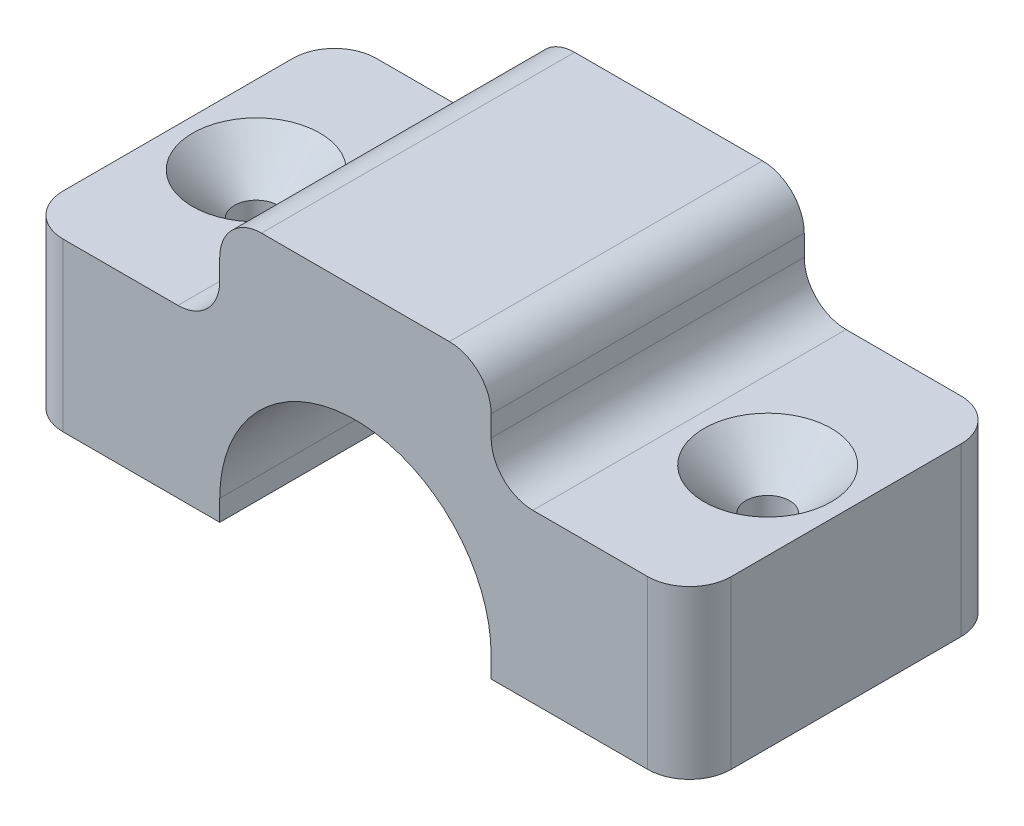
ISO-10303-21;
HEADER;
FILE_DESCRIPTION(('STEP AP214'),'2;1');
FILE_NAME('part.step','',(''),(''),'','','');
FILE_SCHEMA(('AUTOMOTIVE_DESIGN { 1 0 10303 214 1 1 1 1 }'));
ENDSEC;
DATA;
#1=APPLICATION_CONTEXT('core data for automotive mechanical design processes');
#2=APPLICATION_PROTOCOL_DEFINITION('international standard','automotive_design',2000,#1);
#3=PRODUCT_CONTEXT('',#1,'mechanical');
#4=PRODUCT('Part','Part','',(#3));
#5=PRODUCT_RELATED_PRODUCT_CATEGORY('part','',(#4));
#6=PRODUCT_DEFINITION_FORMATION('','',#4);
#7=PRODUCT_DEFINITION_CONTEXT('part definition',#1,'design');
#8=PRODUCT_DEFINITION('design','',#6,#7);
#9=PRODUCT_DEFINITION_SHAPE('','',#8);
#10=(LENGTH_UNIT() NAMED_UNIT(*) SI_UNIT(.MILLI.,.METRE.));
#11=(NAMED_UNIT(*) PLANE_ANGLE_UNIT() SI_UNIT($,.RADIAN.));
#12=(NAMED_UNIT(*) SI_UNIT($,.STERADIAN.) SOLID_ANGLE_UNIT());
#13=UNCERTAINTY_MEASURE_WITH_UNIT(LENGTH_MEASURE(1.E-05),#10,'distance_accuracy_value','');
#14=(GEOMETRIC_REPRESENTATION_CONTEXT(3) GLOBAL_UNCERTAINTY_ASSIGNED_CONTEXT((#13)) GLOBAL_UNIT_ASSIGNED_CONTEXT((#10,
#11,#12)) REPRESENTATION_CONTEXT('',''));
#15=CARTESIAN_POINT('',(0.,0.,0.));
#16=DIRECTION('',(0.,0.,1.));
#17=DIRECTION('',(1.,0.,0.));
#18=AXIS2_PLACEMENT_3D('',#15,#16,#17);
#19=CARTESIAN_POINT('',(0.,12.,15.));
#20=DIRECTION('',(0.,-1.,0.));
#21=DIRECTION('',(1.,0.,0.));
#22=AXIS2_PLACEMENT_3D('',#19,#20,#21);
#23=PLANE('',#22);
#24=DIRECTION('',(-1.,0.,0.));
#25=VECTOR('',#24,1.);
#26=CARTESIAN_POINT('',(0.,12.,15.));
#27=LINE('',#26,#25);
#28=CARTESIAN_POINT('',(4.5,12.,15.));
#29=VERTEX_POINT('',#28);
#30=CARTESIAN_POINT('',(-4.5,12.,15.));
#31=VERTEX_POINT('',#30);
#32=EDGE_CURVE('E418',#29,#31,#27,.T.);
#33=ORIENTED_EDGE('',*,*,#32,.F.);
#34=DIRECTION('',(0.,0.,-1.));
#35=VECTOR('',#34,1.);
#36=CARTESIAN_POINT('',(4.5,12.,0.));
#37=LINE('',#36,#35);
#38=CARTESIAN_POINT('',(4.5,12.,0.));
#39=VERTEX_POINT('',#38);
#40=EDGE_CURVE('E240',#29,#39,#37,.T.);
#41=ORIENTED_EDGE('',*,*,#40,.T.);
#42=DIRECTION('',(-1.,0.,0.));
#43=VECTOR('',#42,1.);
#44=CARTESIAN_POINT('',(0.,12.,0.));
#45=LINE('',#44,#43);
#46=CARTESIAN_POINT('',(-4.5,12.,0.));
#47=VERTEX_POINT('',#46);
#48=EDGE_CURVE('E419',#39,#47,#45,.T.);
#49=ORIENTED_EDGE('',*,*,#48,.T.);
#50=DIRECTION('',(0.,0.,1.));
#51=VECTOR('',#50,1.);
#52=CARTESIAN_POINT('',(-4.5,12.,15.));
#53=LINE('',#52,#51);
#54=EDGE_CURVE('E237',#47,#31,#53,.T.);
#55=ORIENTED_EDGE('',*,*,#54,.T.);
#56=EDGE_LOOP('',(#33,#41,#49,#55));
#57=FACE_BOUND('',#56,.T.);
#58=ADVANCED_FACE('F39',(#57),#23,.F.);
#59=CARTESIAN_POINT('',(0.,0.,15.));
#60=DIRECTION('',(0.,0.,-1.));
#61=DIRECTION('',(-1.,0.,0.));
#62=AXIS2_PLACEMENT_3D('',#59,#60,#61);
#63=CYLINDRICAL_SURFACE('',#62,6.5);
#64=CARTESIAN_POINT('',(0.,0.,0.));
#65=DIRECTION('',(0.,0.,1.));
#66=DIRECTION('',(1.,0.,0.));
#67=AXIS2_PLACEMENT_3D('',#64,#65,#66);
#68=CIRCLE('',#67,6.5);
#69=CARTESIAN_POINT('',(6.5,0.,0.));
#70=VERTEX_POINT('',#69);
#71=CARTESIAN_POINT('',(-6.5,0.,0.));
#72=VERTEX_POINT('',#71);
#73=EDGE_CURVE('E415',#70,#72,#68,.T.);
#74=ORIENTED_EDGE('',*,*,#73,.F.);
#75=DIRECTION('',(0.,0.,-1.));
#76=VECTOR('',#75,1.);
#77=CARTESIAN_POINT('',(6.5,0.,15.));
#78=LINE('',#77,#76);
#79=CARTESIAN_POINT('',(6.5,0.,15.));
#80=VERTEX_POINT('',#79);
#81=EDGE_CURVE('E211',#80,#70,#78,.T.);
#82=ORIENTED_EDGE('',*,*,#81,.F.);
#83=CARTESIAN_POINT('',(0.,0.,15.));
#84=DIRECTION('',(0.,0.,1.));
#85=DIRECTION('',(1.,0.,0.));
#86=AXIS2_PLACEMENT_3D('',#83,#84,#85);
#87=CIRCLE('',#86,6.5);
#88=CARTESIAN_POINT('',(-6.5,0.,15.));
#89=VERTEX_POINT('',#88);
#90=EDGE_CURVE('E416',#80,#89,#87,.T.);
#91=ORIENTED_EDGE('',*,*,#90,.T.);
#92=DIRECTION('',(0.,0.,-1.));
#93=VECTOR('',#92,1.);
#94=CARTESIAN_POINT('',(-6.5,0.,15.));
#95=LINE('',#94,#93);
#96=EDGE_CURVE('E421',#89,#72,#95,.T.);
#97=ORIENTED_EDGE('',*,*,#96,.T.);
#98=EDGE_LOOP('',(#74,#82,#91,#97));
#99=FACE_BOUND('',#98,.T.);
#100=ADVANCED_FACE('F282',(#99),#63,.F.);
#101=CARTESIAN_POINT('',(16.,0.,15.));
#102=DIRECTION('',(-1.,0.,0.));
#103=DIRECTION('',(0.,0.,1.));
#104=AXIS2_PLACEMENT_3D('',#101,#102,#103);
#105=PLANE('',#104);
#106=DIRECTION('',(0.,1.,0.));
#107=VECTOR('',#106,1.);
#108=CARTESIAN_POINT('',(16.,0.,2.));
#109=LINE('',#108,#107);
#110=CARTESIAN_POINT('',(16.,-0.999999999999997,2.));
#111=VERTEX_POINT('',#110);
#112=CARTESIAN_POINT('',(16.,7.,2.));
#113=VERTEX_POINT('',#112);
#114=EDGE_CURVE('E216',#111,#113,#109,.T.);
#115=ORIENTED_EDGE('',*,*,#114,.T.);
#116=DIRECTION('',(0.,0.,1.));
#117=VECTOR('',#116,1.);
#118=CARTESIAN_POINT('',(16.,7.,15.));
#119=LINE('',#118,#117);
#120=CARTESIAN_POINT('',(16.,7.,13.));
#121=VERTEX_POINT('',#120);
#122=EDGE_CURVE('E354',#113,#121,#119,.T.);
#123=ORIENTED_EDGE('',*,*,#122,.T.);
#124=DIRECTION('',(0.,1.,0.));
#125=VECTOR('',#124,1.);
#126=CARTESIAN_POINT('',(16.,0.,13.));
#127=LINE('',#126,#125);
#128=CARTESIAN_POINT('',(16.,-0.999999999999997,13.));
#129=VERTEX_POINT('',#128);
#130=EDGE_CURVE('E219',#121,#129,#127,.F.);
#131=ORIENTED_EDGE('',*,*,#130,.T.);
#132=DIRECTION('',(0.,0.,1.));
#133=VECTOR('',#132,1.);
#134=CARTESIAN_POINT('',(16.,-0.999999999999997,2.));
#135=LINE('',#134,#133);
#136=EDGE_CURVE('E378',#111,#129,#135,.T.);
#137=ORIENTED_EDGE('',*,*,#136,.F.);
#138=EDGE_LOOP('',(#115,#123,#131,#137));
#139=FACE_BOUND('',#138,.T.);
#140=ADVANCED_FACE('F288',(#139),#105,.F.);
#141=CARTESIAN_POINT('',(-16.,0.,15.));
#142=DIRECTION('',(-1.,0.,0.));
#143=DIRECTION('',(0.,0.,1.));
#144=AXIS2_PLACEMENT_3D('',#141,#142,#143);
#145=PLANE('',#144);
#146=DIRECTION('',(0.,0.,-1.));
#147=VECTOR('',#146,1.);
#148=CARTESIAN_POINT('',(-16.,6.99999999999999,15.));
#149=LINE('',#148,#147);
#150=CARTESIAN_POINT('',(-16.,6.99999999999999,13.));
#151=VERTEX_POINT('',#150);
#152=CARTESIAN_POINT('',(-16.,6.99999999999999,2.));
#153=VERTEX_POINT('',#152);
#154=EDGE_CURVE('E179',#151,#153,#149,.T.);
#155=ORIENTED_EDGE('',*,*,#154,.T.);
#156=DIRECTION('',(0.,1.,0.));
#157=VECTOR('',#156,1.);
#158=CARTESIAN_POINT('',(-16.,0.,2.));
#159=LINE('',#158,#157);
#160=CARTESIAN_POINT('',(-16.,-1.,2.));
#161=VERTEX_POINT('',#160);
#162=EDGE_CURVE('E207',#153,#161,#159,.F.);
#163=ORIENTED_EDGE('',*,*,#162,.T.);
#164=DIRECTION('',(0.,0.,-1.));
#165=VECTOR('',#164,1.);
#166=CARTESIAN_POINT('',(-16.,-1.,13.));
#167=LINE('',#166,#165);
#168=CARTESIAN_POINT('',(-16.,-1.,13.));
#169=VERTEX_POINT('',#168);
#170=EDGE_CURVE('E205',#169,#161,#167,.T.);
#171=ORIENTED_EDGE('',*,*,#170,.F.);
#172=DIRECTION('',(0.,1.,0.));
#173=VECTOR('',#172,1.);
#174=CARTESIAN_POINT('',(-16.,0.,13.));
#175=LINE('',#174,#173);
#176=EDGE_CURVE('E196',#169,#151,#175,.T.);
#177=ORIENTED_EDGE('',*,*,#176,.T.);
#178=EDGE_LOOP('',(#155,#163,#171,#177));
#179=FACE_BOUND('',#178,.T.);
#180=ADVANCED_FACE('F203',(#179),#145,.T.);
#181=CARTESIAN_POINT('',(0.,0.,15.));
#182=DIRECTION('',(0.,0.,1.));
#183=DIRECTION('',(1.,0.,0.));
#184=AXIS2_PLACEMENT_3D('',#181,#182,#183);
#185=PLANE('',#184);
#186=DIRECTION('',(0.,1.,0.));
#187=VECTOR('',#186,1.);
#188=CARTESIAN_POINT('',(6.5,6.99999999999999,15.));
#189=LINE('',#188,#187);
#190=CARTESIAN_POINT('',(6.5,8.99999999999999,15.));
#191=VERTEX_POINT('',#190);
#192=CARTESIAN_POINT('',(6.5,9.99999999999999,15.));
#193=VERTEX_POINT('',#192);
#194=EDGE_CURVE('E360',#191,#193,#189,.T.);
#195=ORIENTED_EDGE('',*,*,#194,.T.);
#196=CARTESIAN_POINT('',(4.5,9.99999999999999,15.));
#197=DIRECTION('',(0.,0.,1.));
#198=DIRECTION('',(1.,0.,0.));
#199=AXIS2_PLACEMENT_3D('',#196,#197,#198);
#200=CIRCLE('',#199,2.);
#201=EDGE_CURVE('E248',#193,#29,#200,.T.);
#202=ORIENTED_EDGE('',*,*,#201,.T.);
#203=ORIENTED_EDGE('',*,*,#32,.T.);
#204=CARTESIAN_POINT('',(-4.5,9.99999999999999,15.));
#205=DIRECTION('',(0.,0.,1.));
#206=DIRECTION('',(1.,0.,0.));
#207=AXIS2_PLACEMENT_3D('',#204,#205,#206);
#208=CIRCLE('',#207,2.);
#209=CARTESIAN_POINT('',(-6.5,9.99999999999999,15.));
#210=VERTEX_POINT('',#209);
#211=EDGE_CURVE('E55',#31,#210,#208,.T.);
#212=ORIENTED_EDGE('',*,*,#211,.T.);
#213=DIRECTION('',(0.,1.,0.));
#214=VECTOR('',#213,1.);
#215=CARTESIAN_POINT('',(-6.5,6.99999999999999,15.));
#216=LINE('',#215,#214);
#217=CARTESIAN_POINT('',(-6.5,8.99999999999999,15.));
#218=VERTEX_POINT('',#217);
#219=EDGE_CURVE('E346',#218,#210,#216,.T.);
#220=ORIENTED_EDGE('',*,*,#219,.F.);
#221=CARTESIAN_POINT('',(-8.5,8.99999999999999,15.));
#222=DIRECTION('',(0.,0.,1.));
#223=DIRECTION('',(1.,0.,0.));
#224=AXIS2_PLACEMENT_3D('',#221,#222,#223);
#225=CIRCLE('',#224,2.);
#226=CARTESIAN_POINT('',(-8.5,6.99999999999999,15.));
#227=VERTEX_POINT('',#226);
#228=EDGE_CURVE('E63',#218,#227,#225,.F.);
#229=ORIENTED_EDGE('',*,*,#228,.T.);
#230=DIRECTION('',(-1.,0.,0.));
#231=VECTOR('',#230,1.);
#232=CARTESIAN_POINT('',(0.,6.99999999999999,15.));
#233=LINE('',#232,#231);
#234=CARTESIAN_POINT('',(-14.,6.99999999999999,15.));
#235=VERTEX_POINT('',#234);
#236=EDGE_CURVE('E348',#227,#235,#233,.T.);
#237=ORIENTED_EDGE('',*,*,#236,.T.);
#238=DIRECTION('',(0.,1.,0.));
#239=VECTOR('',#238,1.);
#240=CARTESIAN_POINT('',(-14.,0.,15.));
#241=LINE('',#240,#239);
#242=CARTESIAN_POINT('',(-14.,-1.,15.));
#243=VERTEX_POINT('',#242);
#244=EDGE_CURVE('E198',#235,#243,#241,.F.);
#245=ORIENTED_EDGE('',*,*,#244,.T.);
#246=DIRECTION('',(-1.,0.,0.));
#247=VECTOR('',#246,1.);
#248=CARTESIAN_POINT('',(-6.5,-1.,15.));
#249=LINE('',#248,#247);
#250=CARTESIAN_POINT('',(-6.5,-1.,15.));
#251=VERTEX_POINT('',#250);
#252=EDGE_CURVE('E398',#251,#243,#249,.T.);
#253=ORIENTED_EDGE('',*,*,#252,.F.);
#254=DIRECTION('',(0.,1.,0.));
#255=VECTOR('',#254,1.);
#256=CARTESIAN_POINT('',(-6.5,-1.,15.));
#257=LINE('',#256,#255);
#258=EDGE_CURVE('E412',#251,#89,#257,.T.);
#259=ORIENTED_EDGE('',*,*,#258,.T.);
#260=ORIENTED_EDGE('',*,*,#90,.F.);
#261=DIRECTION('',(0.,1.,0.));
#262=VECTOR('',#261,1.);
#263=CARTESIAN_POINT('',(6.5,-0.999999999999999,15.));
#264=LINE('',#263,#262);
#265=CARTESIAN_POINT('',(6.5,-0.999999999999999,15.));
#266=VERTEX_POINT('',#265);
#267=EDGE_CURVE('E386',#266,#80,#264,.T.);
#268=ORIENTED_EDGE('',*,*,#267,.F.);
#269=DIRECTION('',(-1.,0.,0.));
#270=VECTOR('',#269,1.);
#271=CARTESIAN_POINT('',(14.,-0.999999999999997,15.));
#272=LINE('',#271,#270);
#273=CARTESIAN_POINT('',(14.,-0.999999999999997,15.));
#274=VERTEX_POINT('',#273);
#275=EDGE_CURVE('E384',#274,#266,#272,.T.);
#276=ORIENTED_EDGE('',*,*,#275,.F.);
#277=DIRECTION('',(0.,1.,0.));
#278=VECTOR('',#277,1.);
#279=CARTESIAN_POINT('',(14.,12.,15.));
#280=LINE('',#279,#278);
#281=CARTESIAN_POINT('',(14.,7.,15.));
#282=VERTEX_POINT('',#281);
#283=EDGE_CURVE('E206',#274,#282,#280,.T.);
#284=ORIENTED_EDGE('',*,*,#283,.T.);
#285=DIRECTION('',(-1.,0.,0.));
#286=VECTOR('',#285,1.);
#287=CARTESIAN_POINT('',(0.,6.99999999999999,15.));
#288=LINE('',#287,#286);
#289=CARTESIAN_POINT('',(8.5,7.,15.));
#290=VERTEX_POINT('',#289);
#291=EDGE_CURVE('E357',#282,#290,#288,.T.);
#292=ORIENTED_EDGE('',*,*,#291,.T.);
#293=CARTESIAN_POINT('',(8.5,8.99999999999999,15.));
#294=DIRECTION('',(0.,0.,1.));
#295=DIRECTION('',(1.,0.,0.));
#296=AXIS2_PLACEMENT_3D('',#293,#294,#295);
#297=CIRCLE('',#296,2.);
#298=EDGE_CURVE('E258',#290,#191,#297,.F.);
#299=ORIENTED_EDGE('',*,*,#298,.T.);
#300=EDGE_LOOP('',(#195,#202,#203,#212,#220,#229,#237,#245,#253,#259,#260,#268,#276,#284,#292,#299));
#301=FACE_BOUND('',#300,.T.);
#302=ADVANCED_FACE('F433',(#301),#185,.T.);
#303=CARTESIAN_POINT('',(0.,0.,0.));
#304=DIRECTION('',(0.,0.,1.));
#305=DIRECTION('',(1.,0.,0.));
#306=AXIS2_PLACEMENT_3D('',#303,#304,#305);
#307=PLANE('',#306);
#308=ORIENTED_EDGE('',*,*,#48,.F.);
#309=CARTESIAN_POINT('',(4.5,9.99999999999999,0.));
#310=DIRECTION('',(0.,0.,1.));
#311=DIRECTION('',(1.,0.,0.));
#312=AXIS2_PLACEMENT_3D('',#309,#310,#311);
#313=CIRCLE('',#312,2.);
#314=CARTESIAN_POINT('',(6.5,9.99999999999999,0.));
#315=VERTEX_POINT('',#314);
#316=EDGE_CURVE('E245',#39,#315,#313,.F.);
#317=ORIENTED_EDGE('',*,*,#316,.T.);
#318=DIRECTION('',(0.,1.,0.));
#319=VECTOR('',#318,1.);
#320=CARTESIAN_POINT('',(6.5,6.99999999999999,0.));
#321=LINE('',#320,#319);
#322=CARTESIAN_POINT('',(6.5,8.99999999999999,0.));
#323=VERTEX_POINT('',#322);
#324=EDGE_CURVE('E191',#323,#315,#321,.T.);
#325=ORIENTED_EDGE('',*,*,#324,.F.);
#326=CARTESIAN_POINT('',(8.5,8.99999999999999,0.));
#327=DIRECTION('',(0.,0.,1.));
#328=DIRECTION('',(1.,0.,0.));
#329=AXIS2_PLACEMENT_3D('',#326,#327,#328);
#330=CIRCLE('',#329,2.);
#331=CARTESIAN_POINT('',(8.5,7.,0.));
#332=VERTEX_POINT('',#331);
#333=EDGE_CURVE('E256',#323,#332,#330,.T.);
#334=ORIENTED_EDGE('',*,*,#333,.T.);
#335=DIRECTION('',(1.,0.,0.));
#336=VECTOR('',#335,1.);
#337=CARTESIAN_POINT('',(0.,6.99999999999999,0.));
#338=LINE('',#337,#336);
#339=CARTESIAN_POINT('',(14.,7.,0.));
#340=VERTEX_POINT('',#339);
#341=EDGE_CURVE('E352',#332,#340,#338,.T.);
#342=ORIENTED_EDGE('',*,*,#341,.T.);
#343=DIRECTION('',(0.,1.,0.));
#344=VECTOR('',#343,1.);
#345=CARTESIAN_POINT('',(14.,0.,0.));
#346=LINE('',#345,#344);
#347=CARTESIAN_POINT('',(14.,-0.999999999999997,0.));
#348=VERTEX_POINT('',#347);
#349=EDGE_CURVE('E224',#340,#348,#346,.F.);
#350=ORIENTED_EDGE('',*,*,#349,.T.);
#351=DIRECTION('',(1.,0.,0.));
#352=VECTOR('',#351,1.);
#353=CARTESIAN_POINT('',(6.5,-0.999999999999999,0.));
#354=LINE('',#353,#352);
#355=CARTESIAN_POINT('',(6.5,-0.999999999999999,0.));
#356=VERTEX_POINT('',#355);
#357=EDGE_CURVE('E372',#356,#348,#354,.T.);
#358=ORIENTED_EDGE('',*,*,#357,.F.);
#359=DIRECTION('',(0.,1.,0.));
#360=VECTOR('',#359,1.);
#361=CARTESIAN_POINT('',(6.5,-0.999999999999999,0.));
#362=LINE('',#361,#360);
#363=EDGE_CURVE('E389',#356,#70,#362,.T.);
#364=ORIENTED_EDGE('',*,*,#363,.T.);
#365=ORIENTED_EDGE('',*,*,#73,.T.);
#366=DIRECTION('',(0.,1.,0.));
#367=VECTOR('',#366,1.);
#368=CARTESIAN_POINT('',(-6.5,-1.,0.));
#369=LINE('',#368,#367);
#370=CARTESIAN_POINT('',(-6.5,-1.,0.));
#371=VERTEX_POINT('',#370);
#372=EDGE_CURVE('E409',#371,#72,#369,.T.);
#373=ORIENTED_EDGE('',*,*,#372,.F.);
#374=DIRECTION('',(1.,0.,0.));
#375=VECTOR('',#374,1.);
#376=CARTESIAN_POINT('',(-14.,-1.,0.));
#377=LINE('',#376,#375);
#378=CARTESIAN_POINT('',(-14.,-1.,0.));
#379=VERTEX_POINT('',#378);
#380=EDGE_CURVE('E407',#379,#371,#377,.T.);
#381=ORIENTED_EDGE('',*,*,#380,.F.);
#382=DIRECTION('',(0.,1.,0.));
#383=VECTOR('',#382,1.);
#384=CARTESIAN_POINT('',(-14.,12.,0.));
#385=LINE('',#384,#383);
#386=CARTESIAN_POINT('',(-14.,6.99999999999999,0.));
#387=VERTEX_POINT('',#386);
#388=EDGE_CURVE('E221',#379,#387,#385,.T.);
#389=ORIENTED_EDGE('',*,*,#388,.T.);
#390=DIRECTION('',(1.,0.,0.));
#391=VECTOR('',#390,1.);
#392=CARTESIAN_POINT('',(0.,6.99999999999999,0.));
#393=LINE('',#392,#391);
#394=CARTESIAN_POINT('',(-8.5,6.99999999999999,0.));
#395=VERTEX_POINT('',#394);
#396=EDGE_CURVE('E190',#387,#395,#393,.T.);
#397=ORIENTED_EDGE('',*,*,#396,.T.);
#398=CARTESIAN_POINT('',(-8.5,8.99999999999999,0.));
#399=DIRECTION('',(0.,0.,1.));
#400=DIRECTION('',(1.,0.,0.));
#401=AXIS2_PLACEMENT_3D('',#398,#399,#400);
#402=CIRCLE('',#401,2.);
#403=CARTESIAN_POINT('',(-6.5,8.99999999999999,0.));
#404=VERTEX_POINT('',#403);
#405=EDGE_CURVE('E261',#395,#404,#402,.T.);
#406=ORIENTED_EDGE('',*,*,#405,.T.);
#407=DIRECTION('',(0.,1.,0.));
#408=VECTOR('',#407,1.);
#409=CARTESIAN_POINT('',(-6.5,6.99999999999999,0.));
#410=LINE('',#409,#408);
#411=CARTESIAN_POINT('',(-6.5,9.99999999999999,0.));
#412=VERTEX_POINT('',#411);
#413=EDGE_CURVE('E200',#404,#412,#410,.T.);
#414=ORIENTED_EDGE('',*,*,#413,.T.);
#415=CARTESIAN_POINT('',(-4.5,9.99999999999999,0.));
#416=DIRECTION('',(0.,0.,1.));
#417=DIRECTION('',(1.,0.,0.));
#418=AXIS2_PLACEMENT_3D('',#415,#416,#417);
#419=CIRCLE('',#418,2.);
#420=EDGE_CURVE('E243',#412,#47,#419,.F.);
#421=ORIENTED_EDGE('',*,*,#420,.T.);
#422=EDGE_LOOP('',(#308,#317,#325,#334,#342,#350,#358,#364,#365,#373,#381,#389,#397,#406,#414,#421));
#423=FACE_BOUND('',#422,.T.);
#424=ADVANCED_FACE('F341',(#423),#307,.F.);
#425=CARTESIAN_POINT('',(-12.25,12.000012,7.5));
#426=DIRECTION('',(0.,-1.,0.));
#427=DIRECTION('',(1.,0.,0.));
#428=AXIS2_PLACEMENT_3D('',#425,#426,#427);
#429=CYLINDRICAL_SURFACE('',#428,1.05);
#430=CARTESIAN_POINT('',(-12.25,5.,7.5));
#431=DIRECTION('',(0.,-1.,0.));
#432=DIRECTION('',(0.,0.,-1.));
#433=AXIS2_PLACEMENT_3D('',#430,#431,#432);
#434=CIRCLE('',#433,1.05);
#435=CARTESIAN_POINT('',(-11.2,5.,7.5));
#436=VERTEX_POINT('',#435);
#437=EDGE_CURVE('E11',#436,#436,#434,.F.);
#438=CARTESIAN_POINT('',(-12.25,-1.,7.5));
#439=DIRECTION('',(0.,-1.,0.));
#440=DIRECTION('',(1.,0.,0.));
#441=AXIS2_PLACEMENT_3D('',#438,#439,#440);
#442=CIRCLE('',#441,1.05);
#443=CARTESIAN_POINT('',(-11.2,-1.,7.5));
#444=VERTEX_POINT('',#443);
#445=EDGE_CURVE('E392',#444,#444,#442,.T.);
#446=CARTESIAN_POINT('',(-11.2,5.,7.5));
#447=CARTESIAN_POINT('',(-11.2,4.9375,7.5));
#448=CARTESIAN_POINT('',(-11.2,4.875,7.5));
#449=CARTESIAN_POINT('',(-11.2,4.75,7.5));
#450=CARTESIAN_POINT('',(-11.2,4.6875,7.5));
#451=CARTESIAN_POINT('',(-11.2,4.5625,7.5));
#452=CARTESIAN_POINT('',(-11.2,4.5,7.5));
#453=CARTESIAN_POINT('',(-11.2,4.375,7.5));
#454=CARTESIAN_POINT('',(-11.2,4.3125,7.5));
#455=CARTESIAN_POINT('',(-11.2,4.1875,7.5));
#456=CARTESIAN_POINT('',(-11.2,4.125,7.5));
#457=CARTESIAN_POINT('',(-11.2,4.,7.5));
#458=CARTESIAN_POINT('',(-11.2,3.9375,7.5));
#459=CARTESIAN_POINT('',(-11.2,3.8125,7.5));
#460=CARTESIAN_POINT('',(-11.2,3.75,7.5));
#461=CARTESIAN_POINT('',(-11.2,3.625,7.5));
#462=CARTESIAN_POINT('',(-11.2,3.5625,7.5));
#463=CARTESIAN_POINT('',(-11.2,3.4375,7.5));
#464=CARTESIAN_POINT('',(-11.2,3.375,7.5));
#465=CARTESIAN_POINT('',(-11.2,3.25,7.5));
#466=CARTESIAN_POINT('',(-11.2,3.1875,7.5));
#467=CARTESIAN_POINT('',(-11.2,3.0625,7.5));
#468=CARTESIAN_POINT('',(-11.2,3.,7.5));
#469=CARTESIAN_POINT('',(-11.2,2.875,7.5));
#470=CARTESIAN_POINT('',(-11.2,2.8125,7.5));
#471=CARTESIAN_POINT('',(-11.2,2.6875,7.5));
#472=CARTESIAN_POINT('',(-11.2,2.625,7.5));
#473=CARTESIAN_POINT('',(-11.2,2.5,7.5));
#474=CARTESIAN_POINT('',(-11.2,2.4375,7.5));
#475=CARTESIAN_POINT('',(-11.2,2.3125,7.5));
#476=CARTESIAN_POINT('',(-11.2,2.25,7.5));
#477=CARTESIAN_POINT('',(-11.2,2.125,7.5));
#478=CARTESIAN_POINT('',(-11.2,2.0625,7.5));
#479=CARTESIAN_POINT('',(-11.2,1.9375,7.5));
#480=CARTESIAN_POINT('',(-11.2,1.875,7.5));
#481=CARTESIAN_POINT('',(-11.2,1.75,7.5));
#482=CARTESIAN_POINT('',(-11.2,1.6875,7.5));
#483=CARTESIAN_POINT('',(-11.2,1.5625,7.5));
#484=CARTESIAN_POINT('',(-11.2,1.5,7.5));
#485=CARTESIAN_POINT('',(-11.2,1.375,7.5));
#486=CARTESIAN_POINT('',(-11.2,1.3125,7.5));
#487=CARTESIAN_POINT('',(-11.2,1.1875,7.5));
#488=CARTESIAN_POINT('',(-11.2,1.125,7.5));
#489=CARTESIAN_POINT('',(-11.2,0.999999999999999,7.5));
#490=CARTESIAN_POINT('',(-11.2,0.937499999999999,7.5));
#491=CARTESIAN_POINT('',(-11.2,0.812499999999999,7.5));
#492=CARTESIAN_POINT('',(-11.2,0.749999999999999,7.5));
#493=CARTESIAN_POINT('',(-11.2,0.624999999999999,7.5));
#494=CARTESIAN_POINT('',(-11.2,0.562499999999999,7.5));
#495=CARTESIAN_POINT('',(-11.2,0.437499999999999,7.5));
#496=CARTESIAN_POINT('',(-11.2,0.374999999999999,7.5));
#497=CARTESIAN_POINT('',(-11.2,0.249999999999999,7.5));
#498=CARTESIAN_POINT('',(-11.2,0.187499999999998,7.5));
#499=CARTESIAN_POINT('',(-11.2,0.0624999999999983,7.5));
#500=CARTESIAN_POINT('',(-11.2,0.,7.5));
#501=CARTESIAN_POINT('',(-11.2,-0.125000000000002,7.5));
#502=CARTESIAN_POINT('',(-11.2,-0.187500000000002,7.5));
#503=CARTESIAN_POINT('',(-11.2,-0.312500000000002,7.5));
#504=CARTESIAN_POINT('',(-11.2,-0.375000000000002,7.5));
#505=CARTESIAN_POINT('',(-11.2,-0.500000000000002,7.5));
#506=CARTESIAN_POINT('',(-11.2,-0.562500000000002,7.5));
#507=CARTESIAN_POINT('',(-11.2,-0.687500000000002,7.5));
#508=CARTESIAN_POINT('',(-11.2,-0.750000000000002,7.5));
#509=CARTESIAN_POINT('',(-11.2,-0.875000000000003,7.5));
#510=CARTESIAN_POINT('',(-11.2,-0.937500000000003,7.5));
#511=CARTESIAN_POINT('',(-11.2,-1.,7.5));
#512=B_SPLINE_CURVE_WITH_KNOTS('',3,(#446,#447,#448,#449,#450,#451,#452,#453,#454,#455,#456,
#457,#458,#459,#460,#461,#462,#463,#464,#465,#466,#467,#468,#469,#470,#471,#472,#473,#474,#475,
#476,#477,#478,#479,#480,#481,#482,#483,#484,#485,#486,#487,#488,#489,#490,#491,#492,#493,#494,
#495,#496,#497,#498,#499,#500,#501,#502,#503,#504,#505,#506,#507,#508,#509,#510,#511),
.UNSPECIFIED.,.F.,.F.,(4,2,2,2,2,2,2,2,2,2,2,2,2,2,2,2,2,2,2,2,2,2,2,2,2,2,2,2,2,2,2,2,4),(0.,
0.1875,0.375,0.5625,0.750000000000001,0.9375,1.125,1.3125,1.5,1.6875,1.875,2.0625,2.25,2.4375,
2.625,2.8125,3.,3.1875,3.375,3.5625,3.75,3.9375,4.125,4.3125,4.5,4.6875,4.875,5.0625,5.25,
5.4375,5.625,5.8125,6.),.UNSPECIFIED.);
#513=EDGE_CURVE('BSEAM485',#436,#444,#512,.T.);
#514=ORIENTED_EDGE('',*,*,#437,.T.);
#515=ORIENTED_EDGE('',*,*,#445,.T.);
#516=ORIENTED_EDGE('',*,*,#513,.T.);
#517=ORIENTED_EDGE('',*,*,#513,.F.);
#518=EDGE_LOOP('',(#514,#516,#515,#517));
#519=FACE_BOUND('',#518,.T.);
#520=ADVANCED_FACE('F485',(#519),#429,.F.);
#521=CARTESIAN_POINT('',(12.25,12.000012,7.49999999999999));
#522=DIRECTION('',(0.,-1.,0.));
#523=DIRECTION('',(1.,0.,0.));
#524=AXIS2_PLACEMENT_3D('',#521,#522,#523);
#525=CYLINDRICAL_SURFACE('',#524,1.05);
#526=CARTESIAN_POINT('',(12.25,5.,7.49999999999999));
#527=DIRECTION('',(0.,-1.,0.));
#528=DIRECTION('',(0.,0.,-1.));
#529=AXIS2_PLACEMENT_3D('',#526,#527,#528);
#530=CIRCLE('',#529,1.05);
#531=CARTESIAN_POINT('',(13.3,5.00000000000001,7.49999999999999));
#532=VERTEX_POINT('',#531);
#533=EDGE_CURVE('E266',#532,#532,#530,.F.);
#534=CARTESIAN_POINT('',(12.25,-0.999999999999998,7.49999999999999));
#535=DIRECTION('',(0.,-1.,0.));
#536=DIRECTION('',(1.,0.,0.));
#537=AXIS2_PLACEMENT_3D('',#534,#535,#536);
#538=CIRCLE('',#537,1.05);
#539=CARTESIAN_POINT('',(13.3,-0.999999999999999,7.49999999999999));
#540=VERTEX_POINT('',#539);
#541=EDGE_CURVE('E366',#540,#540,#538,.T.);
#542=CARTESIAN_POINT('',(13.3,5.00000000000001,7.49999999999999));
#543=CARTESIAN_POINT('',(13.3,4.93750000000001,7.49999999999999));
#544=CARTESIAN_POINT('',(13.3,4.87500000000001,7.49999999999999));
#545=CARTESIAN_POINT('',(13.3,4.75000000000001,7.49999999999999));
#546=CARTESIAN_POINT('',(13.3,4.68750000000001,7.49999999999999));
#547=CARTESIAN_POINT('',(13.3,4.56250000000001,7.49999999999999));
#548=CARTESIAN_POINT('',(13.3,4.5,7.49999999999999));
#549=CARTESIAN_POINT('',(13.3,4.375,7.49999999999999));
#550=CARTESIAN_POINT('',(13.3,4.3125,7.49999999999999));
#551=CARTESIAN_POINT('',(13.3,4.1875,7.49999999999999));
#552=CARTESIAN_POINT('',(13.3,4.12500000000001,7.49999999999999));
#553=CARTESIAN_POINT('',(13.3,4.00000000000001,7.49999999999999));
#554=CARTESIAN_POINT('',(13.3,3.93750000000001,7.49999999999999));
#555=CARTESIAN_POINT('',(13.3,3.81250000000001,7.49999999999999));
#556=CARTESIAN_POINT('',(13.3,3.75,7.49999999999999));
#557=CARTESIAN_POINT('',(13.3,3.625,7.49999999999999));
#558=CARTESIAN_POINT('',(13.3,3.5625,7.49999999999999));
#559=CARTESIAN_POINT('',(13.3,3.4375,7.49999999999999));
#560=CARTESIAN_POINT('',(13.3,3.375,7.49999999999999));
#561=CARTESIAN_POINT('',(13.3,3.25,7.49999999999999));
#562=CARTESIAN_POINT('',(13.3,3.1875,7.49999999999999));
#563=CARTESIAN_POINT('',(13.3,3.0625,7.49999999999999));
#564=CARTESIAN_POINT('',(13.3,3.,7.49999999999999));
#565=CARTESIAN_POINT('',(13.3,2.875,7.49999999999999));
#566=CARTESIAN_POINT('',(13.3,2.8125,7.49999999999999));
#567=CARTESIAN_POINT('',(13.3,2.6875,7.49999999999999));
#568=CARTESIAN_POINT('',(13.3,2.625,7.49999999999999));
#569=CARTESIAN_POINT('',(13.3,2.5,7.49999999999999));
#570=CARTESIAN_POINT('',(13.3,2.4375,7.49999999999999));
#571=CARTESIAN_POINT('',(13.3,2.3125,7.49999999999999));
#572=CARTESIAN_POINT('',(13.3,2.25,7.49999999999999));
#573=CARTESIAN_POINT('',(13.3,2.125,7.49999999999999));
#574=CARTESIAN_POINT('',(13.3,2.0625,7.49999999999999));
#575=CARTESIAN_POINT('',(13.3,1.9375,7.49999999999999));
#576=CARTESIAN_POINT('',(13.3,1.875,7.49999999999999));
#577=CARTESIAN_POINT('',(13.3,1.75,7.49999999999999));
#578=CARTESIAN_POINT('',(13.3,1.6875,7.49999999999999));
#579=CARTESIAN_POINT('',(13.3,1.5625,7.49999999999999));
#580=CARTESIAN_POINT('',(13.3,1.5,7.49999999999999));
#581=CARTESIAN_POINT('',(13.3,1.375,7.49999999999999));
#582=CARTESIAN_POINT('',(13.3,1.3125,7.49999999999999));
#583=CARTESIAN_POINT('',(13.3,1.1875,7.49999999999999));
#584=CARTESIAN_POINT('',(13.3,1.125,7.49999999999999));
#585=CARTESIAN_POINT('',(13.3,1.,7.49999999999999));
#586=CARTESIAN_POINT('',(13.3,0.937500000000003,7.49999999999999));
#587=CARTESIAN_POINT('',(13.3,0.812500000000002,7.49999999999999));
#588=CARTESIAN_POINT('',(13.3,0.750000000000002,7.49999999999999));
#589=CARTESIAN_POINT('',(13.3,0.625000000000002,7.49999999999999));
#590=CARTESIAN_POINT('',(13.3,0.562500000000002,7.49999999999999));
#591=CARTESIAN_POINT('',(13.3,0.437500000000002,7.49999999999999));
#592=CARTESIAN_POINT('',(13.3,0.375000000000002,7.49999999999999));
#593=CARTESIAN_POINT('',(13.3,0.250000000000002,7.49999999999999));
#594=CARTESIAN_POINT('',(13.3,0.187500000000002,7.49999999999999));
#595=CARTESIAN_POINT('',(13.3,0.0625000000000018,7.49999999999999));
#596=CARTESIAN_POINT('',(13.3,0.,7.49999999999999));
#597=CARTESIAN_POINT('',(13.3,-0.124999999999998,7.49999999999999));
#598=CARTESIAN_POINT('',(13.3,-0.187499999999998,7.49999999999999));
#599=CARTESIAN_POINT('',(13.3,-0.312499999999999,7.49999999999999));
#600=CARTESIAN_POINT('',(13.3,-0.374999999999999,7.49999999999999));
#601=CARTESIAN_POINT('',(13.3,-0.499999999999999,7.49999999999999));
#602=CARTESIAN_POINT('',(13.3,-0.562499999999999,7.49999999999999));
#603=CARTESIAN_POINT('',(13.3,-0.687499999999999,7.49999999999999));
#604=CARTESIAN_POINT('',(13.3,-0.749999999999999,7.49999999999999));
#605=CARTESIAN_POINT('',(13.3,-0.874999999999999,7.49999999999999));
#606=CARTESIAN_POINT('',(13.3,-0.937499999999999,7.49999999999999));
#607=CARTESIAN_POINT('',(13.3,-0.999999999999999,7.49999999999999));
#608=B_SPLINE_CURVE_WITH_KNOTS('',3,(#542,#543,#544,#545,#546,#547,#548,#549,#550,#551,#552,
#553,#554,#555,#556,#557,#558,#559,#560,#561,#562,#563,#564,#565,#566,#567,#568,#569,#570,#571,
#572,#573,#574,#575,#576,#577,#578,#579,#580,#581,#582,#583,#584,#585,#586,#587,#588,#589,#590,
#591,#592,#593,#594,#595,#596,#597,#598,#599,#600,#601,#602,#603,#604,#605,#606,#607),
.UNSPECIFIED.,.F.,.F.,(4,2,2,2,2,2,2,2,2,2,2,2,2,2,2,2,2,2,2,2,2,2,2,2,2,2,2,2,2,2,2,2,4),(0.,
0.1875,0.375,0.5625,0.750000000000001,0.9375,1.125,1.3125,1.5,1.6875,1.875,2.0625,2.25,2.4375,
2.625,2.8125,3.,3.1875,3.375,3.5625,3.75,3.9375,4.125,4.3125,4.5,4.6875,4.875,5.0625,5.25,
5.4375,5.625,5.8125,6.),.UNSPECIFIED.);
#609=EDGE_CURVE('BSEAM301',#532,#540,#608,.T.);
#610=ORIENTED_EDGE('',*,*,#533,.T.);
#611=ORIENTED_EDGE('',*,*,#541,.T.);
#612=ORIENTED_EDGE('',*,*,#609,.T.);
#613=ORIENTED_EDGE('',*,*,#609,.F.);
#614=EDGE_LOOP('',(#610,#612,#611,#613));
#615=FACE_BOUND('',#614,.T.);
#616=ADVANCED_FACE('F301',(#615),#525,.F.);
#617=CARTESIAN_POINT('',(-14.,0.,13.));
#618=DIRECTION('',(0.,1.,0.));
#619=DIRECTION('',(0.,0.,1.));
#620=AXIS2_PLACEMENT_3D('',#617,#618,#619);
#621=CYLINDRICAL_SURFACE('',#620,2.);
#622=CARTESIAN_POINT('',(-14.,6.99999999999999,13.));
#623=DIRECTION('',(0.,-1.,0.));
#624=DIRECTION('',(1.,0.,0.));
#625=AXIS2_PLACEMENT_3D('',#622,#623,#624);
#626=CIRCLE('',#625,2.);
#627=EDGE_CURVE('E183',#151,#235,#626,.F.);
#628=ORIENTED_EDGE('',*,*,#627,.F.);
#629=ORIENTED_EDGE('',*,*,#176,.F.);
#630=CARTESIAN_POINT('',(-14.,-1.,13.));
#631=DIRECTION('',(0.,-1.,0.));
#632=DIRECTION('',(1.,0.,0.));
#633=AXIS2_PLACEMENT_3D('',#630,#631,#632);
#634=CIRCLE('',#633,2.);
#635=EDGE_CURVE('E401',#243,#169,#634,.T.);
#636=ORIENTED_EDGE('',*,*,#635,.F.);
#637=ORIENTED_EDGE('',*,*,#244,.F.);
#638=EDGE_LOOP('',(#628,#629,#636,#637));
#639=FACE_BOUND('',#638,.T.);
#640=ADVANCED_FACE('F194',(#639),#621,.T.);
#641=CARTESIAN_POINT('',(14.,0.,13.));
#642=DIRECTION('',(0.,-1.,0.));
#643=DIRECTION('',(0.,0.,-1.));
#644=AXIS2_PLACEMENT_3D('',#641,#642,#643);
#645=CYLINDRICAL_SURFACE('',#644,2.);
#646=CARTESIAN_POINT('',(14.,7.,13.));
#647=DIRECTION('',(0.,-1.,0.));
#648=DIRECTION('',(1.,0.,0.));
#649=AXIS2_PLACEMENT_3D('',#646,#647,#648);
#650=CIRCLE('',#649,2.);
#651=EDGE_CURVE('E199',#282,#121,#650,.F.);
#652=ORIENTED_EDGE('',*,*,#651,.F.);
#653=ORIENTED_EDGE('',*,*,#283,.F.);
#654=CARTESIAN_POINT('',(14.,-0.999999999999997,13.));
#655=DIRECTION('',(0.,-1.,0.));
#656=DIRECTION('',(1.,0.,0.));
#657=AXIS2_PLACEMENT_3D('',#654,#655,#656);
#658=CIRCLE('',#657,2.);
#659=EDGE_CURVE('E381',#129,#274,#658,.T.);
#660=ORIENTED_EDGE('',*,*,#659,.F.);
#661=ORIENTED_EDGE('',*,*,#130,.F.);
#662=EDGE_LOOP('',(#652,#653,#660,#661));
#663=FACE_BOUND('',#662,.T.);
#664=ADVANCED_FACE('F300',(#663),#645,.T.);
#665=CARTESIAN_POINT('',(14.,0.,2.));
#666=DIRECTION('',(0.,1.,0.));
#667=DIRECTION('',(0.,0.,1.));
#668=AXIS2_PLACEMENT_3D('',#665,#666,#667);
#669=CYLINDRICAL_SURFACE('',#668,2.);
#670=CARTESIAN_POINT('',(14.,7.,2.));
#671=DIRECTION('',(0.,-1.,0.));
#672=DIRECTION('',(1.,0.,0.));
#673=AXIS2_PLACEMENT_3D('',#670,#671,#672);
#674=CIRCLE('',#673,2.);
#675=EDGE_CURVE('E227',#113,#340,#674,.F.);
#676=ORIENTED_EDGE('',*,*,#675,.F.);
#677=ORIENTED_EDGE('',*,*,#114,.F.);
#678=CARTESIAN_POINT('',(14.,-0.999999999999997,2.));
#679=DIRECTION('',(0.,-1.,0.));
#680=DIRECTION('',(1.,0.,0.));
#681=AXIS2_PLACEMENT_3D('',#678,#679,#680);
#682=CIRCLE('',#681,2.);
#683=EDGE_CURVE('E375',#348,#111,#682,.T.);
#684=ORIENTED_EDGE('',*,*,#683,.F.);
#685=ORIENTED_EDGE('',*,*,#349,.F.);
#686=EDGE_LOOP('',(#676,#677,#684,#685));
#687=FACE_BOUND('',#686,.T.);
#688=ADVANCED_FACE('F304',(#687),#669,.T.);
#689=CARTESIAN_POINT('',(-14.,0.,2.));
#690=DIRECTION('',(0.,-1.,0.));
#691=DIRECTION('',(0.,0.,-1.));
#692=AXIS2_PLACEMENT_3D('',#689,#690,#691);
#693=CYLINDRICAL_SURFACE('',#692,2.);
#694=CARTESIAN_POINT('',(-14.,6.99999999999999,2.));
#695=DIRECTION('',(0.,-1.,0.));
#696=DIRECTION('',(1.,0.,0.));
#697=AXIS2_PLACEMENT_3D('',#694,#695,#696);
#698=CIRCLE('',#697,2.);
#699=EDGE_CURVE('E186',#387,#153,#698,.F.);
#700=ORIENTED_EDGE('',*,*,#699,.F.);
#701=ORIENTED_EDGE('',*,*,#388,.F.);
#702=CARTESIAN_POINT('',(-14.,-1.,2.));
#703=DIRECTION('',(0.,-1.,0.));
#704=DIRECTION('',(1.,0.,0.));
#705=AXIS2_PLACEMENT_3D('',#702,#703,#704);
#706=CIRCLE('',#705,2.);
#707=EDGE_CURVE('E404',#161,#379,#706,.T.);
#708=ORIENTED_EDGE('',*,*,#707,.F.);
#709=ORIENTED_EDGE('',*,*,#162,.F.);
#710=EDGE_LOOP('',(#700,#701,#708,#709));
#711=FACE_BOUND('',#710,.T.);
#712=ADVANCED_FACE('F308',(#711),#693,.T.);
#713=CARTESIAN_POINT('',(-14.,-1.,13.));
#714=DIRECTION('',(0.,-1.,0.));
#715=DIRECTION('',(1.,0.,0.));
#716=AXIS2_PLACEMENT_3D('',#713,#714,#715);
#717=PLANE('',#716);
#718=DIRECTION('',(0.,0.,1.));
#719=VECTOR('',#718,1.);
#720=CARTESIAN_POINT('',(-6.5,-1.,0.));
#721=LINE('',#720,#719);
#722=EDGE_CURVE('E395',#371,#251,#721,.T.);
#723=ORIENTED_EDGE('',*,*,#722,.T.);
#724=ORIENTED_EDGE('',*,*,#252,.T.);
#725=ORIENTED_EDGE('',*,*,#635,.T.);
#726=ORIENTED_EDGE('',*,*,#170,.T.);
#727=ORIENTED_EDGE('',*,*,#707,.T.);
#728=ORIENTED_EDGE('',*,*,#380,.T.);
#729=EDGE_LOOP('',(#723,#724,#725,#726,#727,#728));
#730=FACE_BOUND('',#729,.T.);
#731=ORIENTED_EDGE('',*,*,#445,.F.);
#732=EDGE_LOOP('',(#731));
#733=FACE_BOUND('',#732,.T.);
#734=ADVANCED_FACE('F312',(#730,#733),#717,.T.);
#735=CARTESIAN_POINT('',(-6.5,-1.,0.));
#736=DIRECTION('',(-1.,0.,0.));
#737=DIRECTION('',(0.,-1.,0.));
#738=AXIS2_PLACEMENT_3D('',#735,#736,#737);
#739=PLANE('',#738);
#740=ORIENTED_EDGE('',*,*,#96,.F.);
#741=ORIENTED_EDGE('',*,*,#258,.F.);
#742=ORIENTED_EDGE('',*,*,#722,.F.);
#743=ORIENTED_EDGE('',*,*,#372,.T.);
#744=EDGE_LOOP('',(#740,#741,#742,#743));
#745=FACE_BOUND('',#744,.T.);
#746=ADVANCED_FACE('F439',(#745),#739,.F.);
#747=CARTESIAN_POINT('',(14.,-0.999999999999997,2.));
#748=DIRECTION('',(0.,-1.,0.));
#749=DIRECTION('',(1.,0.,0.));
#750=AXIS2_PLACEMENT_3D('',#747,#748,#749);
#751=PLANE('',#750);
#752=DIRECTION('',(0.,0.,-1.));
#753=VECTOR('',#752,1.);
#754=CARTESIAN_POINT('',(6.5,-0.999999999999999,15.));
#755=LINE('',#754,#753);
#756=EDGE_CURVE('E369',#266,#356,#755,.T.);
#757=ORIENTED_EDGE('',*,*,#756,.T.);
#758=ORIENTED_EDGE('',*,*,#357,.T.);
#759=ORIENTED_EDGE('',*,*,#683,.T.);
#760=ORIENTED_EDGE('',*,*,#136,.T.);
#761=ORIENTED_EDGE('',*,*,#659,.T.);
#762=ORIENTED_EDGE('',*,*,#275,.T.);
#763=EDGE_LOOP('',(#757,#758,#759,#760,#761,#762));
#764=FACE_BOUND('',#763,.T.);
#765=ORIENTED_EDGE('',*,*,#541,.F.);
#766=EDGE_LOOP('',(#765));
#767=FACE_BOUND('',#766,.T.);
#768=ADVANCED_FACE('F445',(#764,#767),#751,.T.);
#769=CARTESIAN_POINT('',(6.5,-0.999999999999999,15.));
#770=DIRECTION('',(1.,0.,0.));
#771=DIRECTION('',(0.,1.,0.));
#772=AXIS2_PLACEMENT_3D('',#769,#770,#771);
#773=PLANE('',#772);
#774=ORIENTED_EDGE('',*,*,#81,.T.);
#775=ORIENTED_EDGE('',*,*,#363,.F.);
#776=ORIENTED_EDGE('',*,*,#756,.F.);
#777=ORIENTED_EDGE('',*,*,#267,.T.);
#778=EDGE_LOOP('',(#774,#775,#776,#777));
#779=FACE_BOUND('',#778,.T.);
#780=ADVANCED_FACE('F429',(#779),#773,.F.);
#781=CARTESIAN_POINT('',(0.,6.99999999999999,0.));
#782=DIRECTION('',(0.,-1.,0.));
#783=DIRECTION('',(1.,0.,0.));
#784=AXIS2_PLACEMENT_3D('',#781,#782,#783);
#785=PLANE('',#784);
#786=CARTESIAN_POINT('',(-12.25,6.99999999999999,7.5));
#787=DIRECTION('',(0.,-1.,0.));
#788=DIRECTION('',(1.,0.,0.));
#789=AXIS2_PLACEMENT_3D('',#786,#787,#788);
#790=CIRCLE('',#789,3.04999999999999);
#791=CARTESIAN_POINT('',(-9.20000000000001,6.99999999999999,7.5));
#792=VERTEX_POINT('',#791);
#793=EDGE_CURVE('E48',#792,#792,#790,.T.);
#794=ORIENTED_EDGE('',*,*,#793,.T.);
#795=EDGE_LOOP('',(#794));
#796=FACE_BOUND('',#795,.T.);
#797=ORIENTED_EDGE('',*,*,#236,.F.);
#798=DIRECTION('',(0.,0.,1.));
#799=VECTOR('',#798,1.);
#800=CARTESIAN_POINT('',(-8.5,6.99999999999999,0.));
#801=LINE('',#800,#799);
#802=EDGE_CURVE('E254',#227,#395,#801,.F.);
#803=ORIENTED_EDGE('',*,*,#802,.T.);
#804=ORIENTED_EDGE('',*,*,#396,.F.);
#805=ORIENTED_EDGE('',*,*,#699,.T.);
#806=ORIENTED_EDGE('',*,*,#154,.F.);
#807=ORIENTED_EDGE('',*,*,#627,.T.);
#808=EDGE_LOOP('',(#797,#803,#804,#805,#806,#807));
#809=FACE_BOUND('',#808,.T.);
#810=ADVANCED_FACE('F182',(#796,#809),#785,.F.);
#811=CARTESIAN_POINT('',(-6.5,6.99999999999999,15.));
#812=DIRECTION('',(-1.,0.,0.));
#813=DIRECTION('',(0.,-1.,0.));
#814=AXIS2_PLACEMENT_3D('',#811,#812,#813);
#815=PLANE('',#814);
#816=ORIENTED_EDGE('',*,*,#219,.T.);
#817=DIRECTION('',(0.,0.,1.));
#818=VECTOR('',#817,1.);
#819=CARTESIAN_POINT('',(-6.5,9.99999999999999,0.));
#820=LINE('',#819,#818);
#821=EDGE_CURVE('E252',#210,#412,#820,.F.);
#822=ORIENTED_EDGE('',*,*,#821,.T.);
#823=ORIENTED_EDGE('',*,*,#413,.F.);
#824=DIRECTION('',(0.,0.,1.));
#825=VECTOR('',#824,1.);
#826=CARTESIAN_POINT('',(-6.5,8.99999999999999,15.));
#827=LINE('',#826,#825);
#828=EDGE_CURVE('E250',#404,#218,#827,.T.);
#829=ORIENTED_EDGE('',*,*,#828,.T.);
#830=EDGE_LOOP('',(#816,#822,#823,#829));
#831=FACE_BOUND('',#830,.T.);
#832=ADVANCED_FACE('F344',(#831),#815,.T.);
#833=CARTESIAN_POINT('',(0.,6.99999999999999,0.));
#834=DIRECTION('',(0.,-1.,0.));
#835=DIRECTION('',(1.,0.,0.));
#836=AXIS2_PLACEMENT_3D('',#833,#834,#835);
#837=PLANE('',#836);
#838=CARTESIAN_POINT('',(12.25,7.,7.49999999999999));
#839=DIRECTION('',(0.,-1.,0.));
#840=DIRECTION('',(1.,0.,0.));
#841=AXIS2_PLACEMENT_3D('',#838,#839,#840);
#842=CIRCLE('',#841,3.04999999999999);
#843=CARTESIAN_POINT('',(15.3,7.,7.49999999999999));
#844=VERTEX_POINT('',#843);
#845=EDGE_CURVE('E263',#844,#844,#842,.T.);
#846=ORIENTED_EDGE('',*,*,#845,.T.);
#847=EDGE_LOOP('',(#846));
#848=FACE_BOUND('',#847,.T.);
#849=ORIENTED_EDGE('',*,*,#341,.F.);
#850=DIRECTION('',(0.,0.,-1.));
#851=VECTOR('',#850,1.);
#852=CARTESIAN_POINT('',(8.5,7.,0.));
#853=LINE('',#852,#851);
#854=EDGE_CURVE('E235',#332,#290,#853,.F.);
#855=ORIENTED_EDGE('',*,*,#854,.T.);
#856=ORIENTED_EDGE('',*,*,#291,.F.);
#857=ORIENTED_EDGE('',*,*,#651,.T.);
#858=ORIENTED_EDGE('',*,*,#122,.F.);
#859=ORIENTED_EDGE('',*,*,#675,.T.);
#860=EDGE_LOOP('',(#849,#855,#856,#857,#858,#859));
#861=FACE_BOUND('',#860,.T.);
#862=ADVANCED_FACE('F453',(#848,#861),#837,.F.);
#863=CARTESIAN_POINT('',(6.5,6.99999999999999,15.));
#864=DIRECTION('',(1.,0.,0.));
#865=DIRECTION('',(0.,1.,0.));
#866=AXIS2_PLACEMENT_3D('',#863,#864,#865);
#867=PLANE('',#866);
#868=ORIENTED_EDGE('',*,*,#194,.F.);
#869=DIRECTION('',(0.,0.,-1.));
#870=VECTOR('',#869,1.);
#871=CARTESIAN_POINT('',(6.5,8.99999999999999,15.));
#872=LINE('',#871,#870);
#873=EDGE_CURVE('E232',#191,#323,#872,.T.);
#874=ORIENTED_EDGE('',*,*,#873,.T.);
#875=ORIENTED_EDGE('',*,*,#324,.T.);
#876=DIRECTION('',(0.,0.,-1.));
#877=VECTOR('',#876,1.);
#878=CARTESIAN_POINT('',(6.5,9.99999999999999,15.));
#879=LINE('',#878,#877);
#880=EDGE_CURVE('E230',#315,#193,#879,.F.);
#881=ORIENTED_EDGE('',*,*,#880,.T.);
#882=EDGE_LOOP('',(#868,#874,#875,#881));
#883=FACE_BOUND('',#882,.T.);
#884=ADVANCED_FACE('F318',(#883),#867,.T.);
#885=CARTESIAN_POINT('',(8.5,8.99999999999999,15.));
#886=DIRECTION('',(0.,0.,-1.));
#887=DIRECTION('',(-1.,0.,0.));
#888=AXIS2_PLACEMENT_3D('',#885,#886,#887);
#889=CYLINDRICAL_SURFACE('',#888,2.);
#890=ORIENTED_EDGE('',*,*,#298,.F.);
#891=ORIENTED_EDGE('',*,*,#854,.F.);
#892=ORIENTED_EDGE('',*,*,#333,.F.);
#893=ORIENTED_EDGE('',*,*,#873,.F.);
#894=EDGE_LOOP('',(#890,#891,#892,#893));
#895=FACE_BOUND('',#894,.T.);
#896=ADVANCED_FACE('F314',(#895),#889,.F.);
#897=CARTESIAN_POINT('',(4.5,9.99999999999999,15.));
#898=DIRECTION('',(0.,0.,1.));
#899=DIRECTION('',(1.,0.,0.));
#900=AXIS2_PLACEMENT_3D('',#897,#898,#899);
#901=CYLINDRICAL_SURFACE('',#900,2.);
#902=ORIENTED_EDGE('',*,*,#201,.F.);
#903=ORIENTED_EDGE('',*,*,#880,.F.);
#904=ORIENTED_EDGE('',*,*,#316,.F.);
#905=ORIENTED_EDGE('',*,*,#40,.F.);
#906=EDGE_LOOP('',(#902,#903,#904,#905));
#907=FACE_BOUND('',#906,.T.);
#908=ADVANCED_FACE('F317',(#907),#901,.T.);
#909=CARTESIAN_POINT('',(-4.5,9.99999999999999,15.));
#910=DIRECTION('',(0.,0.,-1.));
#911=DIRECTION('',(-1.,0.,0.));
#912=AXIS2_PLACEMENT_3D('',#909,#910,#911);
#913=CYLINDRICAL_SURFACE('',#912,2.);
#914=ORIENTED_EDGE('',*,*,#420,.F.);
#915=ORIENTED_EDGE('',*,*,#821,.F.);
#916=ORIENTED_EDGE('',*,*,#211,.F.);
#917=ORIENTED_EDGE('',*,*,#54,.F.);
#918=EDGE_LOOP('',(#914,#915,#916,#917));
#919=FACE_BOUND('',#918,.T.);
#920=ADVANCED_FACE('F322',(#919),#913,.T.);
#921=CARTESIAN_POINT('',(-8.5,8.99999999999999,15.));
#922=DIRECTION('',(0.,0.,1.));
#923=DIRECTION('',(1.,0.,0.));
#924=AXIS2_PLACEMENT_3D('',#921,#922,#923);
#925=CYLINDRICAL_SURFACE('',#924,2.);
#926=ORIENTED_EDGE('',*,*,#405,.F.);
#927=ORIENTED_EDGE('',*,*,#802,.F.);
#928=ORIENTED_EDGE('',*,*,#228,.F.);
#929=ORIENTED_EDGE('',*,*,#828,.F.);
#930=EDGE_LOOP('',(#926,#927,#928,#929));
#931=FACE_BOUND('',#930,.T.);
#932=ADVANCED_FACE('F278',(#931),#925,.F.);
#933=CARTESIAN_POINT('',(12.25,7.,7.49999999999999));
#934=DIRECTION('',(0.,1.,0.));
#935=DIRECTION('',(0.,0.,1.));
#936=AXIS2_PLACEMENT_3D('',#933,#934,#935);
#937=CONICAL_SURFACE('',#936,3.04999999999999,0.785398163397447);
#938=ORIENTED_EDGE('',*,*,#533,.F.);
#939=EDGE_LOOP('',(#938));
#940=FACE_BOUND('',#939,.T.);
#941=ORIENTED_EDGE('',*,*,#845,.F.);
#942=EDGE_LOOP('',(#941));
#943=FACE_BOUND('',#942,.T.);
#944=ADVANCED_FACE('F273',(#940,#943),#937,.F.);
#945=CARTESIAN_POINT('',(-12.25,6.99999999999999,7.5));
#946=DIRECTION('',(0.,1.,0.));
#947=DIRECTION('',(0.,0.,1.));
#948=AXIS2_PLACEMENT_3D('',#945,#946,#947);
#949=CONICAL_SURFACE('',#948,3.04999999999999,0.785398163397447);
#950=ORIENTED_EDGE('',*,*,#437,.F.);
#951=EDGE_LOOP('',(#950));
#952=FACE_BOUND('',#951,.T.);
#953=ORIENTED_EDGE('',*,*,#793,.F.);
#954=EDGE_LOOP('',(#953));
#955=FACE_BOUND('',#954,.T.);
#956=ADVANCED_FACE('F42',(#952,#955),#949,.F.);
#957=CLOSED_SHELL('',(#58,#100,#140,#180,#302,#424,#520,#616,#640,#664,#688,#712,#734,#746,#768,
#780,#810,#832,#862,#884,#896,#908,#920,#932,#944,#956));
#958=MANIFOLD_SOLID_BREP('B2',#957);
#959=ADVANCED_BREP_SHAPE_REPRESENTATION('',(#18,#958),#14);
#960=SHAPE_DEFINITION_REPRESENTATION(#9,#959);
ENDSEC;
END-ISO-10303-21;
